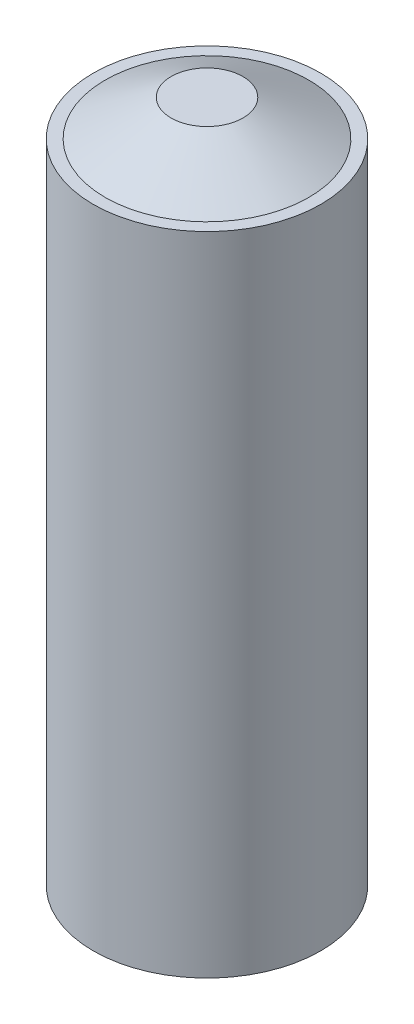
ISO-10303-21;
HEADER;
FILE_DESCRIPTION(('STEP AP214'),'2;1');
FILE_NAME('part.step','',(''),(''),'','','');
FILE_SCHEMA(('AUTOMOTIVE_DESIGN { 1 0 10303 214 1 1 1 1 }'));
ENDSEC;
DATA;
#1=APPLICATION_CONTEXT('core data for automotive mechanical design processes');
#2=APPLICATION_PROTOCOL_DEFINITION('international standard','automotive_design',2000,#1);
#3=PRODUCT_CONTEXT('',#1,'mechanical');
#4=PRODUCT('Part','Part','',(#3));
#5=PRODUCT_RELATED_PRODUCT_CATEGORY('part','',(#4));
#6=PRODUCT_DEFINITION_FORMATION('','',#4);
#7=PRODUCT_DEFINITION_CONTEXT('part definition',#1,'design');
#8=PRODUCT_DEFINITION('design','',#6,#7);
#9=PRODUCT_DEFINITION_SHAPE('','',#8);
#10=(LENGTH_UNIT() NAMED_UNIT(*) SI_UNIT(.MILLI.,.METRE.));
#11=(NAMED_UNIT(*) PLANE_ANGLE_UNIT() SI_UNIT($,.RADIAN.));
#12=(NAMED_UNIT(*) SI_UNIT($,.STERADIAN.) SOLID_ANGLE_UNIT());
#13=UNCERTAINTY_MEASURE_WITH_UNIT(LENGTH_MEASURE(1.E-05),#10,'distance_accuracy_value','');
#14=(GEOMETRIC_REPRESENTATION_CONTEXT(3) GLOBAL_UNCERTAINTY_ASSIGNED_CONTEXT((#13)) GLOBAL_UNIT_ASSIGNED_CONTEXT((#10,
#11,#12)) REPRESENTATION_CONTEXT('',''));
#15=CARTESIAN_POINT('',(0.,0.,0.));
#16=DIRECTION('',(0.,0.,1.));
#17=DIRECTION('',(1.,0.,0.));
#18=AXIS2_PLACEMENT_3D('',#15,#16,#17);
#19=CARTESIAN_POINT('',(0.,-60.,0.));
#20=DIRECTION('',(0.,1.,0.));
#21=DIRECTION('',(0.,0.,1.));
#22=AXIS2_PLACEMENT_3D('',#19,#20,#21);
#23=PLANE('',#22);
#24=CARTESIAN_POINT('',(0.,-60.,0.));
#25=DIRECTION('',(0.,1.,0.));
#26=DIRECTION('',(0.,0.,1.));
#27=AXIS2_PLACEMENT_3D('',#24,#25,#26);
#28=CIRCLE('',#27,5.99999999999999);
#29=CARTESIAN_POINT('',(0.,-60.,5.99999999999999));
#30=VERTEX_POINT('',#29);
#31=EDGE_CURVE('E10',#30,#30,#28,.T.);
#32=ORIENTED_EDGE('',*,*,#31,.F.);
#33=EDGE_LOOP('',(#32));
#34=FACE_BOUND('',#33,.T.);
#35=ADVANCED_FACE('F30',(#34),#23,.F.);
#36=CARTESIAN_POINT('',(0.,-60.,0.));
#37=DIRECTION('',(0.,1.,0.));
#38=DIRECTION('',(0.,0.,1.));
#39=AXIS2_PLACEMENT_3D('',#36,#37,#38);
#40=CONICAL_SURFACE('',#39,5.99999999999999,1.07144960511477);
#41=CARTESIAN_POINT('',(0.,-54.0000000000001,0.));
#42=DIRECTION('',(0.,1.,0.));
#43=DIRECTION('',(0.,0.,1.));
#44=AXIS2_PLACEMENT_3D('',#41,#42,#43);
#45=CIRCLE('',#44,17.);
#46=CARTESIAN_POINT('',(0.,-54.0000000000001,17.));
#47=VERTEX_POINT('',#46);
#48=EDGE_CURVE('E36',#47,#47,#45,.T.);
#49=ORIENTED_EDGE('',*,*,#48,.F.);
#50=EDGE_LOOP('',(#49));
#51=FACE_BOUND('',#50,.T.);
#52=ORIENTED_EDGE('',*,*,#31,.T.);
#53=EDGE_LOOP('',(#52));
#54=FACE_BOUND('',#53,.T.);
#55=ADVANCED_FACE('F78',(#51,#54),#40,.T.);
#56=CARTESIAN_POINT('',(19.,-54.0000000000001,0.));
#57=DIRECTION('',(0.,1.,0.));
#58=DIRECTION('',(0.,0.,1.));
#59=AXIS2_PLACEMENT_3D('',#56,#57,#58);
#60=PLANE('',#59);
#61=CARTESIAN_POINT('',(0.,-54.0000000000001,0.));
#62=DIRECTION('',(0.,1.,0.));
#63=DIRECTION('',(0.,0.,1.));
#64=AXIS2_PLACEMENT_3D('',#61,#62,#63);
#65=CIRCLE('',#64,19.);
#66=CARTESIAN_POINT('',(0.,-54.0000000000001,19.));
#67=VERTEX_POINT('',#66);
#68=EDGE_CURVE('E40',#67,#67,#65,.T.);
#69=ORIENTED_EDGE('',*,*,#68,.F.);
#70=EDGE_LOOP('',(#69));
#71=FACE_BOUND('',#70,.T.);
#72=ORIENTED_EDGE('',*,*,#48,.T.);
#73=EDGE_LOOP('',(#72));
#74=FACE_BOUND('',#73,.T.);
#75=ADVANCED_FACE('F73',(#71,#74),#60,.F.);
#76=CARTESIAN_POINT('',(0.,60.,0.));
#77=DIRECTION('',(0.,1.,0.));
#78=DIRECTION('',(0.,0.,1.));
#79=AXIS2_PLACEMENT_3D('',#76,#77,#78);
#80=CYLINDRICAL_SURFACE('',#79,19.);
#81=CARTESIAN_POINT('',(0.,54.,0.));
#82=DIRECTION('',(0.,1.,0.));
#83=DIRECTION('',(0.,0.,1.));
#84=AXIS2_PLACEMENT_3D('',#81,#82,#83);
#85=CIRCLE('',#84,19.);
#86=CARTESIAN_POINT('',(0.,54.,19.));
#87=VERTEX_POINT('',#86);
#88=EDGE_CURVE('E44',#87,#87,#85,.T.);
#89=ORIENTED_EDGE('',*,*,#88,.F.);
#90=EDGE_LOOP('',(#89));
#91=FACE_BOUND('',#90,.T.);
#92=ORIENTED_EDGE('',*,*,#68,.T.);
#93=EDGE_LOOP('',(#92));
#94=FACE_BOUND('',#93,.T.);
#95=ADVANCED_FACE('F67',(#91,#94),#80,.T.);
#96=CARTESIAN_POINT('',(19.,54.,0.));
#97=DIRECTION('',(0.,-1.,0.));
#98=DIRECTION('',(0.,0.,-1.));
#99=AXIS2_PLACEMENT_3D('',#96,#97,#98);
#100=PLANE('',#99);
#101=CARTESIAN_POINT('',(0.,54.,0.));
#102=DIRECTION('',(0.,1.,0.));
#103=DIRECTION('',(0.,0.,1.));
#104=AXIS2_PLACEMENT_3D('',#101,#102,#103);
#105=CIRCLE('',#104,17.);
#106=CARTESIAN_POINT('',(0.,54.,17.));
#107=VERTEX_POINT('',#106);
#108=EDGE_CURVE('E49',#107,#107,#105,.T.);
#109=ORIENTED_EDGE('',*,*,#108,.F.);
#110=EDGE_LOOP('',(#109));
#111=FACE_BOUND('',#110,.T.);
#112=ORIENTED_EDGE('',*,*,#88,.T.);
#113=EDGE_LOOP('',(#112));
#114=FACE_BOUND('',#113,.T.);
#115=ADVANCED_FACE('F61',(#111,#114),#100,.F.);
#116=CARTESIAN_POINT('',(0.,54.,0.));
#117=DIRECTION('',(0.,-1.,0.));
#118=DIRECTION('',(0.,0.,-1.));
#119=AXIS2_PLACEMENT_3D('',#116,#117,#118);
#120=CONICAL_SURFACE('',#119,17.,1.07144960511477);
#121=CARTESIAN_POINT('',(0.,60.,0.));
#122=DIRECTION('',(0.,1.,0.));
#123=DIRECTION('',(0.,0.,1.));
#124=AXIS2_PLACEMENT_3D('',#121,#122,#123);
#125=CIRCLE('',#124,5.99999999999999);
#126=CARTESIAN_POINT('',(0.,60.,5.99999999999999));
#127=VERTEX_POINT('',#126);
#128=EDGE_CURVE('E52',#127,#127,#125,.T.);
#129=ORIENTED_EDGE('',*,*,#128,.F.);
#130=EDGE_LOOP('',(#129));
#131=FACE_BOUND('',#130,.T.);
#132=ORIENTED_EDGE('',*,*,#108,.T.);
#133=EDGE_LOOP('',(#132));
#134=FACE_BOUND('',#133,.T.);
#135=ADVANCED_FACE('F58',(#131,#134),#120,.T.);
#136=CARTESIAN_POINT('',(0.,60.,0.));
#137=DIRECTION('',(0.,-1.,0.));
#138=DIRECTION('',(0.,0.,-1.));
#139=AXIS2_PLACEMENT_3D('',#136,#137,#138);
#140=PLANE('',#139);
#141=ORIENTED_EDGE('',*,*,#128,.T.);
#142=EDGE_LOOP('',(#141));
#143=FACE_BOUND('',#142,.T.);
#144=ADVANCED_FACE('F56',(#143),#140,.F.);
#145=CLOSED_SHELL('',(#35,#55,#75,#95,#115,#135,#144));
#146=MANIFOLD_SOLID_BREP('B2',#145);
#147=ADVANCED_BREP_SHAPE_REPRESENTATION('',(#18,#146),#14);
#148=SHAPE_DEFINITION_REPRESENTATION(#9,#147);
ENDSEC;
END-ISO-10303-21;
